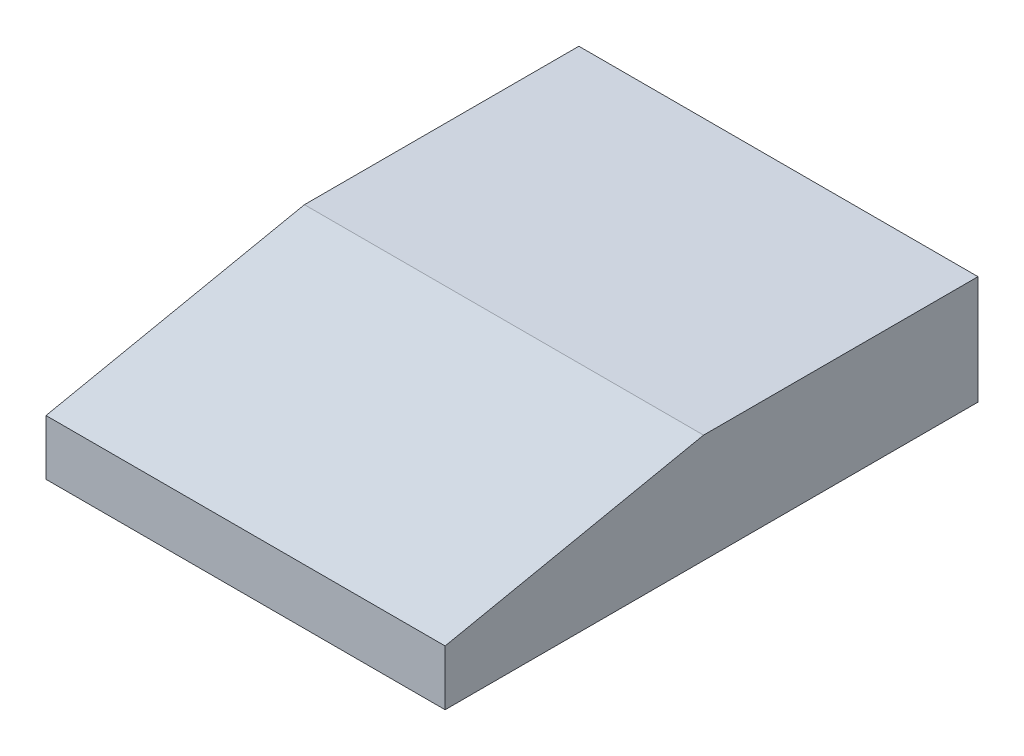
ISO-10303-21;
HEADER;
FILE_DESCRIPTION(('STEP AP214'),'2;1');
FILE_NAME('part.step','',(''),(''),'','','');
FILE_SCHEMA(('AUTOMOTIVE_DESIGN { 1 0 10303 214 1 1 1 1 }'));
ENDSEC;
DATA;
#1=APPLICATION_CONTEXT('core data for automotive mechanical design processes');
#2=APPLICATION_PROTOCOL_DEFINITION('international standard','automotive_design',2000,#1);
#3=PRODUCT_CONTEXT('',#1,'mechanical');
#4=PRODUCT('Part','Part','',(#3));
#5=PRODUCT_RELATED_PRODUCT_CATEGORY('part','',(#4));
#6=PRODUCT_DEFINITION_FORMATION('','',#4);
#7=PRODUCT_DEFINITION_CONTEXT('part definition',#1,'design');
#8=PRODUCT_DEFINITION('design','',#6,#7);
#9=PRODUCT_DEFINITION_SHAPE('','',#8);
#10=(LENGTH_UNIT() NAMED_UNIT(*) SI_UNIT(.MILLI.,.METRE.));
#11=(NAMED_UNIT(*) PLANE_ANGLE_UNIT() SI_UNIT($,.RADIAN.));
#12=(NAMED_UNIT(*) SI_UNIT($,.STERADIAN.) SOLID_ANGLE_UNIT());
#13=UNCERTAINTY_MEASURE_WITH_UNIT(LENGTH_MEASURE(1.E-05),#10,'distance_accuracy_value','');
#14=(GEOMETRIC_REPRESENTATION_CONTEXT(3) GLOBAL_UNCERTAINTY_ASSIGNED_CONTEXT((#13)) GLOBAL_UNIT_ASSIGNED_CONTEXT((#10,
#11,#12)) REPRESENTATION_CONTEXT('',''));
#15=CARTESIAN_POINT('',(0.,0.,0.));
#16=DIRECTION('',(0.,0.,1.));
#17=DIRECTION('',(1.,0.,0.));
#18=AXIS2_PLACEMENT_3D('',#15,#16,#17);
#19=CARTESIAN_POINT('',(48.,13.0667015838241,0.));
#20=DIRECTION('',(0.,0.,1.));
#21=DIRECTION('',(1.,0.,0.));
#22=AXIS2_PLACEMENT_3D('',#19,#20,#21);
#23=PLANE('',#22);
#24=DIRECTION('',(0.,1.,0.));
#25=VECTOR('',#24,1.);
#26=CARTESIAN_POINT('',(0.,13.0667015838241,0.));
#27=LINE('',#26,#25);
#28=CARTESIAN_POINT('',(0.,0.,0.));
#29=VERTEX_POINT('',#28);
#30=CARTESIAN_POINT('',(0.,13.0667015838241,0.));
#31=VERTEX_POINT('',#30);
#32=EDGE_CURVE('E124',#29,#31,#27,.T.);
#33=ORIENTED_EDGE('',*,*,#32,.T.);
#34=DIRECTION('',(-1.,0.,0.));
#35=VECTOR('',#34,1.);
#36=CARTESIAN_POINT('',(48.,13.0667015838241,0.));
#37=LINE('',#36,#35);
#38=CARTESIAN_POINT('',(48.,13.0667015838241,0.));
#39=VERTEX_POINT('',#38);
#40=EDGE_CURVE('E11',#39,#31,#37,.T.);
#41=ORIENTED_EDGE('',*,*,#40,.F.);
#42=DIRECTION('',(0.,1.,0.));
#43=VECTOR('',#42,1.);
#44=CARTESIAN_POINT('',(48.,13.0667015838241,0.));
#45=LINE('',#44,#43);
#46=CARTESIAN_POINT('',(48.,0.,0.));
#47=VERTEX_POINT('',#46);
#48=EDGE_CURVE('E137',#47,#39,#45,.T.);
#49=ORIENTED_EDGE('',*,*,#48,.F.);
#50=DIRECTION('',(-1.,0.,0.));
#51=VECTOR('',#50,1.);
#52=CARTESIAN_POINT('',(48.,0.,0.));
#53=LINE('',#52,#51);
#54=EDGE_CURVE('E120',#47,#29,#53,.T.);
#55=ORIENTED_EDGE('',*,*,#54,.T.);
#56=EDGE_LOOP('',(#33,#41,#49,#55));
#57=FACE_BOUND('',#56,.T.);
#58=ADVANCED_FACE('F45',(#57),#23,.F.);
#59=CARTESIAN_POINT('',(48.,13.0667015838241,33.0067524161692));
#60=DIRECTION('',(0.,-1.,0.));
#61=DIRECTION('',(0.,0.,-1.));
#62=AXIS2_PLACEMENT_3D('',#59,#60,#61);
#63=PLANE('',#62);
#64=DIRECTION('',(0.,0.,1.));
#65=VECTOR('',#64,1.);
#66=CARTESIAN_POINT('',(0.,13.0667015838241,33.0067524161692));
#67=LINE('',#66,#65);
#68=CARTESIAN_POINT('',(0.,13.0667015838241,33.0067524161692));
#69=VERTEX_POINT('',#68);
#70=EDGE_CURVE('E128',#31,#69,#67,.T.);
#71=ORIENTED_EDGE('',*,*,#70,.T.);
#72=DIRECTION('',(-1.,0.,0.));
#73=VECTOR('',#72,1.);
#74=CARTESIAN_POINT('',(48.,13.0667015838241,33.0067524161692));
#75=LINE('',#74,#73);
#76=CARTESIAN_POINT('',(48.,13.0667015838241,33.0067524161692));
#77=VERTEX_POINT('',#76);
#78=EDGE_CURVE('E54',#77,#69,#75,.T.);
#79=ORIENTED_EDGE('',*,*,#78,.F.);
#80=DIRECTION('',(0.,0.,1.));
#81=VECTOR('',#80,1.);
#82=CARTESIAN_POINT('',(48.,13.0667015838241,33.0067524161692));
#83=LINE('',#82,#81);
#84=EDGE_CURVE('E96',#39,#77,#83,.T.);
#85=ORIENTED_EDGE('',*,*,#84,.F.);
#86=ORIENTED_EDGE('',*,*,#40,.T.);
#87=EDGE_LOOP('',(#71,#79,#85,#86));
#88=FACE_BOUND('',#87,.T.);
#89=ADVANCED_FACE('F159',(#88),#63,.F.);
#90=CARTESIAN_POINT('',(48.,6.64687967779929,64.0845266430622));
#91=DIRECTION('',(0.,-0.97932328352164,-0.202301523356583));
#92=DIRECTION('',(0.,0.202301523356583,-0.97932328352164));
#93=AXIS2_PLACEMENT_3D('',#90,#91,#92);
#94=PLANE('',#93);
#95=DIRECTION('',(0.,-0.202301523356583,0.97932328352164));
#96=VECTOR('',#95,1.);
#97=CARTESIAN_POINT('',(0.,6.64687967779929,64.0845266430622));
#98=LINE('',#97,#96);
#99=CARTESIAN_POINT('',(0.,6.64687967779929,64.0845266430622));
#100=VERTEX_POINT('',#99);
#101=EDGE_CURVE('E112',#69,#100,#98,.T.);
#102=ORIENTED_EDGE('',*,*,#101,.T.);
#103=DIRECTION('',(-1.,0.,0.));
#104=VECTOR('',#103,1.);
#105=CARTESIAN_POINT('',(48.,6.64687967779929,64.0845266430622));
#106=LINE('',#105,#104);
#107=CARTESIAN_POINT('',(48.,6.64687967779929,64.0845266430622));
#108=VERTEX_POINT('',#107);
#109=EDGE_CURVE('E109',#108,#100,#106,.T.);
#110=ORIENTED_EDGE('',*,*,#109,.F.);
#111=DIRECTION('',(0.,-0.202301523356583,0.97932328352164));
#112=VECTOR('',#111,1.);
#113=CARTESIAN_POINT('',(48.,6.64687967779929,64.0845266430622));
#114=LINE('',#113,#112);
#115=EDGE_CURVE('E100',#77,#108,#114,.T.);
#116=ORIENTED_EDGE('',*,*,#115,.F.);
#117=ORIENTED_EDGE('',*,*,#78,.T.);
#118=EDGE_LOOP('',(#102,#110,#116,#117));
#119=FACE_BOUND('',#118,.T.);
#120=ADVANCED_FACE('F110',(#119),#94,.F.);
#121=CARTESIAN_POINT('',(48.,0.,64.0845266430622));
#122=DIRECTION('',(0.,0.,-1.));
#123=DIRECTION('',(-1.,0.,0.));
#124=AXIS2_PLACEMENT_3D('',#121,#122,#123);
#125=PLANE('',#124);
#126=DIRECTION('',(0.,-1.,0.));
#127=VECTOR('',#126,1.);
#128=CARTESIAN_POINT('',(0.,0.,64.0845266430622));
#129=LINE('',#128,#127);
#130=CARTESIAN_POINT('',(0.,0.,64.0845266430622));
#131=VERTEX_POINT('',#130);
#132=EDGE_CURVE('E82',#100,#131,#129,.T.);
#133=ORIENTED_EDGE('',*,*,#132,.T.);
#134=DIRECTION('',(-1.,0.,0.));
#135=VECTOR('',#134,1.);
#136=CARTESIAN_POINT('',(48.,0.,64.0845266430622));
#137=LINE('',#136,#135);
#138=CARTESIAN_POINT('',(48.,0.,64.0845266430622));
#139=VERTEX_POINT('',#138);
#140=EDGE_CURVE('E114',#139,#131,#137,.T.);
#141=ORIENTED_EDGE('',*,*,#140,.F.);
#142=DIRECTION('',(0.,-1.,0.));
#143=VECTOR('',#142,1.);
#144=CARTESIAN_POINT('',(48.,0.,64.0845266430622));
#145=LINE('',#144,#143);
#146=EDGE_CURVE('E104',#108,#139,#145,.T.);
#147=ORIENTED_EDGE('',*,*,#146,.F.);
#148=ORIENTED_EDGE('',*,*,#109,.T.);
#149=EDGE_LOOP('',(#133,#141,#147,#148));
#150=FACE_BOUND('',#149,.T.);
#151=ADVANCED_FACE('F116',(#150),#125,.F.);
#152=CARTESIAN_POINT('',(48.,0.,0.));
#153=DIRECTION('',(0.,1.,0.));
#154=DIRECTION('',(0.,0.,1.));
#155=AXIS2_PLACEMENT_3D('',#152,#153,#154);
#156=PLANE('',#155);
#157=DIRECTION('',(0.,0.,-1.));
#158=VECTOR('',#157,1.);
#159=CARTESIAN_POINT('',(0.,0.,0.));
#160=LINE('',#159,#158);
#161=EDGE_CURVE('E88',#131,#29,#160,.T.);
#162=ORIENTED_EDGE('',*,*,#161,.T.);
#163=ORIENTED_EDGE('',*,*,#54,.F.);
#164=DIRECTION('',(0.,0.,-1.));
#165=VECTOR('',#164,1.);
#166=CARTESIAN_POINT('',(48.,0.,0.));
#167=LINE('',#166,#165);
#168=EDGE_CURVE('E62',#139,#47,#167,.T.);
#169=ORIENTED_EDGE('',*,*,#168,.F.);
#170=ORIENTED_EDGE('',*,*,#140,.T.);
#171=EDGE_LOOP('',(#162,#163,#169,#170));
#172=FACE_BOUND('',#171,.T.);
#173=ADVANCED_FACE('F148',(#172),#156,.F.);
#174=CARTESIAN_POINT('',(48.,0.,0.));
#175=DIRECTION('',(-1.,0.,0.));
#176=DIRECTION('',(0.,0.,1.));
#177=AXIS2_PLACEMENT_3D('',#174,#175,#176);
#178=PLANE('',#177);
#179=ORIENTED_EDGE('',*,*,#48,.T.);
#180=ORIENTED_EDGE('',*,*,#84,.T.);
#181=ORIENTED_EDGE('',*,*,#115,.T.);
#182=ORIENTED_EDGE('',*,*,#146,.T.);
#183=ORIENTED_EDGE('',*,*,#168,.T.);
#184=EDGE_LOOP('',(#179,#180,#181,#182,#183));
#185=FACE_BOUND('',#184,.T.);
#186=ADVANCED_FACE('F102',(#185),#178,.F.);
#187=CARTESIAN_POINT('',(0.,0.,0.));
#188=DIRECTION('',(-1.,0.,0.));
#189=DIRECTION('',(0.,0.,1.));
#190=AXIS2_PLACEMENT_3D('',#187,#188,#189);
#191=PLANE('',#190);
#192=ORIENTED_EDGE('',*,*,#32,.F.);
#193=ORIENTED_EDGE('',*,*,#161,.F.);
#194=ORIENTED_EDGE('',*,*,#132,.F.);
#195=ORIENTED_EDGE('',*,*,#101,.F.);
#196=ORIENTED_EDGE('',*,*,#70,.F.);
#197=EDGE_LOOP('',(#192,#193,#194,#195,#196));
#198=FACE_BOUND('',#197,.T.);
#199=ADVANCED_FACE('F144',(#198),#191,.T.);
#200=CLOSED_SHELL('',(#58,#89,#120,#151,#173,#186,#199));
#201=MANIFOLD_SOLID_BREP('B2',#200);
#202=ADVANCED_BREP_SHAPE_REPRESENTATION('',(#18,#201),#14);
#203=SHAPE_DEFINITION_REPRESENTATION(#9,#202);
ENDSEC;
END-ISO-10303-21;
